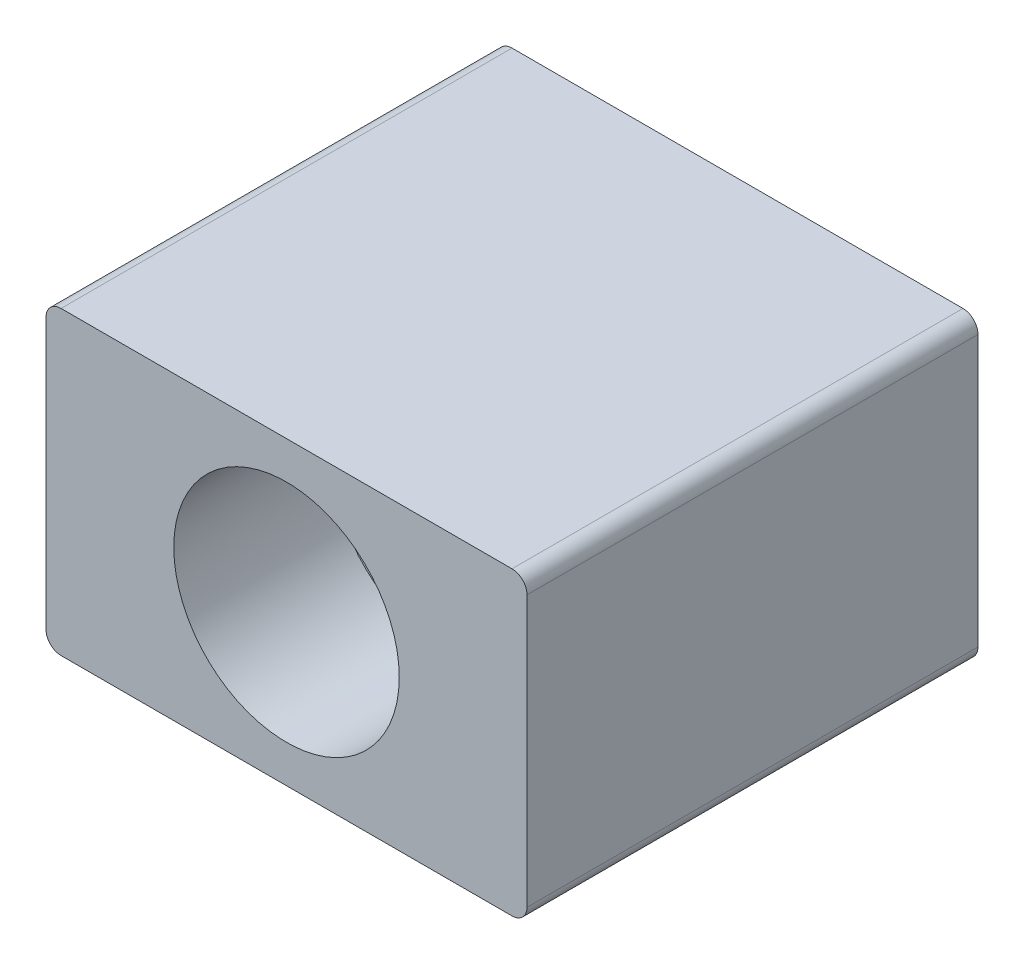
ISO-10303-21;
HEADER;
FILE_DESCRIPTION(('STEP AP214'),'2;1');
FILE_NAME('part.step','',(''),(''),'','','');
FILE_SCHEMA(('AUTOMOTIVE_DESIGN { 1 0 10303 214 1 1 1 1 }'));
ENDSEC;
DATA;
#1=APPLICATION_CONTEXT('core data for automotive mechanical design processes');
#2=APPLICATION_PROTOCOL_DEFINITION('international standard','automotive_design',2000,#1);
#3=PRODUCT_CONTEXT('',#1,'mechanical');
#4=PRODUCT('Part','Part','',(#3));
#5=PRODUCT_RELATED_PRODUCT_CATEGORY('part','',(#4));
#6=PRODUCT_DEFINITION_FORMATION('','',#4);
#7=PRODUCT_DEFINITION_CONTEXT('part definition',#1,'design');
#8=PRODUCT_DEFINITION('design','',#6,#7);
#9=PRODUCT_DEFINITION_SHAPE('','',#8);
#10=(LENGTH_UNIT() NAMED_UNIT(*) SI_UNIT(.MILLI.,.METRE.));
#11=(NAMED_UNIT(*) PLANE_ANGLE_UNIT() SI_UNIT($,.RADIAN.));
#12=(NAMED_UNIT(*) SI_UNIT($,.STERADIAN.) SOLID_ANGLE_UNIT());
#13=UNCERTAINTY_MEASURE_WITH_UNIT(LENGTH_MEASURE(1.E-05),#10,'distance_accuracy_value','');
#14=(GEOMETRIC_REPRESENTATION_CONTEXT(3) GLOBAL_UNCERTAINTY_ASSIGNED_CONTEXT((#13)) GLOBAL_UNIT_ASSIGNED_CONTEXT((#10,
#11,#12)) REPRESENTATION_CONTEXT('',''));
#15=CARTESIAN_POINT('',(0.,0.,0.));
#16=DIRECTION('',(0.,0.,1.));
#17=DIRECTION('',(1.,0.,0.));
#18=AXIS2_PLACEMENT_3D('',#15,#16,#17);
#19=CARTESIAN_POINT('',(0.,0.,-15.));
#20=DIRECTION('',(0.,0.,1.));
#21=DIRECTION('',(1.,0.,0.));
#22=AXIS2_PLACEMENT_3D('',#19,#20,#21);
#23=CYLINDRICAL_SURFACE('',#22,5.25);
#24=CARTESIAN_POINT('',(0.,0.,4.5));
#25=DIRECTION('',(0.,0.,1.));
#26=DIRECTION('',(1.,0.,0.));
#27=AXIS2_PLACEMENT_3D('',#24,#25,#26);
#28=CIRCLE('',#27,5.25);
#29=CARTESIAN_POINT('',(5.25000000000001,0.,4.5));
#30=VERTEX_POINT('',#29);
#31=EDGE_CURVE('E136',#30,#30,#28,.F.);
#32=ORIENTED_EDGE('',*,*,#31,.F.);
#33=EDGE_LOOP('',(#32));
#34=FACE_BOUND('',#33,.T.);
#35=CARTESIAN_POINT('',(0.,0.,-4.5));
#36=DIRECTION('',(0.,0.,-1.));
#37=DIRECTION('',(-1.,0.,0.));
#38=AXIS2_PLACEMENT_3D('',#35,#36,#37);
#39=CIRCLE('',#38,5.25);
#40=CARTESIAN_POINT('',(-5.24999999999999,0.,-4.5));
#41=VERTEX_POINT('',#40);
#42=EDGE_CURVE('E37',#41,#41,#39,.F.);
#43=ORIENTED_EDGE('',*,*,#42,.F.);
#44=EDGE_LOOP('',(#43));
#45=FACE_BOUND('',#44,.T.);
#46=ADVANCED_FACE('F33',(#34,#45),#23,.F.);
#47=CARTESIAN_POINT('',(15.,9.00000000000001,-15.));
#48=DIRECTION('',(0.,0.,1.));
#49=DIRECTION('',(1.,0.,0.));
#50=AXIS2_PLACEMENT_3D('',#47,#48,#49);
#51=CYLINDRICAL_SURFACE('',#50,1.);
#52=CARTESIAN_POINT('',(15.,9.00000000000001,15.));
#53=DIRECTION('',(0.,0.,1.));
#54=DIRECTION('',(1.,0.,0.));
#55=AXIS2_PLACEMENT_3D('',#52,#53,#54);
#56=CIRCLE('',#55,1.);
#57=CARTESIAN_POINT('',(16.,9.,15.));
#58=VERTEX_POINT('',#57);
#59=CARTESIAN_POINT('',(15.,10.,15.));
#60=VERTEX_POINT('',#59);
#61=EDGE_CURVE('E132',#58,#60,#56,.T.);
#62=ORIENTED_EDGE('',*,*,#61,.F.);
#63=DIRECTION('',(0.,0.,1.));
#64=VECTOR('',#63,1.);
#65=CARTESIAN_POINT('',(16.,9.,-15.));
#66=LINE('',#65,#64);
#67=CARTESIAN_POINT('',(16.,9.,-15.));
#68=VERTEX_POINT('',#67);
#69=EDGE_CURVE('E11',#68,#58,#66,.T.);
#70=ORIENTED_EDGE('',*,*,#69,.F.);
#71=CARTESIAN_POINT('',(15.,9.00000000000001,-15.));
#72=DIRECTION('',(0.,0.,1.));
#73=DIRECTION('',(1.,0.,0.));
#74=AXIS2_PLACEMENT_3D('',#71,#72,#73);
#75=CIRCLE('',#74,1.);
#76=CARTESIAN_POINT('',(15.,10.,-15.));
#77=VERTEX_POINT('',#76);
#78=EDGE_CURVE('E153',#68,#77,#75,.T.);
#79=ORIENTED_EDGE('',*,*,#78,.T.);
#80=DIRECTION('',(0.,0.,1.));
#81=VECTOR('',#80,1.);
#82=CARTESIAN_POINT('',(15.,10.,-15.));
#83=LINE('',#82,#81);
#84=EDGE_CURVE('E90',#77,#60,#83,.T.);
#85=ORIENTED_EDGE('',*,*,#84,.T.);
#86=EDGE_LOOP('',(#62,#70,#79,#85));
#87=FACE_BOUND('',#86,.T.);
#88=ADVANCED_FACE('F35',(#87),#51,.T.);
#89=CARTESIAN_POINT('',(16.,9.,-15.));
#90=DIRECTION('',(1.,0.,0.));
#91=DIRECTION('',(0.,1.,0.));
#92=AXIS2_PLACEMENT_3D('',#89,#90,#91);
#93=PLANE('',#92);
#94=DIRECTION('',(0.,1.,0.));
#95=VECTOR('',#94,1.);
#96=CARTESIAN_POINT('',(16.,9.,15.));
#97=LINE('',#96,#95);
#98=CARTESIAN_POINT('',(16.,-8.99999999999999,15.));
#99=VERTEX_POINT('',#98);
#100=EDGE_CURVE('E151',#99,#58,#97,.T.);
#101=ORIENTED_EDGE('',*,*,#100,.F.);
#102=DIRECTION('',(0.,0.,1.));
#103=VECTOR('',#102,1.);
#104=CARTESIAN_POINT('',(16.,-8.99999999999999,-15.));
#105=LINE('',#104,#103);
#106=CARTESIAN_POINT('',(16.,-8.99999999999999,-15.));
#107=VERTEX_POINT('',#106);
#108=EDGE_CURVE('E43',#107,#99,#105,.T.);
#109=ORIENTED_EDGE('',*,*,#108,.F.);
#110=DIRECTION('',(0.,1.,0.));
#111=VECTOR('',#110,1.);
#112=CARTESIAN_POINT('',(16.,9.,-15.));
#113=LINE('',#112,#111);
#114=EDGE_CURVE('E122',#107,#68,#113,.T.);
#115=ORIENTED_EDGE('',*,*,#114,.T.);
#116=ORIENTED_EDGE('',*,*,#69,.T.);
#117=EDGE_LOOP('',(#101,#109,#115,#116));
#118=FACE_BOUND('',#117,.T.);
#119=ADVANCED_FACE('F196',(#118),#93,.T.);
#120=CARTESIAN_POINT('',(15.,-9.,-15.));
#121=DIRECTION('',(0.,0.,1.));
#122=DIRECTION('',(1.,0.,0.));
#123=AXIS2_PLACEMENT_3D('',#120,#121,#122);
#124=CYLINDRICAL_SURFACE('',#123,0.999999999999999);
#125=CARTESIAN_POINT('',(15.,-9.,15.));
#126=DIRECTION('',(0.,0.,1.));
#127=DIRECTION('',(1.,0.,0.));
#128=AXIS2_PLACEMENT_3D('',#125,#126,#127);
#129=CIRCLE('',#128,0.999999999999999);
#130=CARTESIAN_POINT('',(15.,-10.,15.));
#131=VERTEX_POINT('',#130);
#132=EDGE_CURVE('E109',#131,#99,#129,.T.);
#133=ORIENTED_EDGE('',*,*,#132,.F.);
#134=DIRECTION('',(0.,0.,1.));
#135=VECTOR('',#134,1.);
#136=CARTESIAN_POINT('',(15.,-10.,-15.));
#137=LINE('',#136,#135);
#138=CARTESIAN_POINT('',(15.,-10.,-15.));
#139=VERTEX_POINT('',#138);
#140=EDGE_CURVE('E104',#139,#131,#137,.T.);
#141=ORIENTED_EDGE('',*,*,#140,.F.);
#142=CARTESIAN_POINT('',(15.,-9.,-15.));
#143=DIRECTION('',(0.,0.,1.));
#144=DIRECTION('',(1.,0.,0.));
#145=AXIS2_PLACEMENT_3D('',#142,#143,#144);
#146=CIRCLE('',#145,0.999999999999999);
#147=EDGE_CURVE('E107',#139,#107,#146,.T.);
#148=ORIENTED_EDGE('',*,*,#147,.T.);
#149=ORIENTED_EDGE('',*,*,#108,.T.);
#150=EDGE_LOOP('',(#133,#141,#148,#149));
#151=FACE_BOUND('',#150,.T.);
#152=ADVANCED_FACE('F106',(#151),#124,.T.);
#153=CARTESIAN_POINT('',(-15.,-10.,-15.));
#154=DIRECTION('',(0.,-1.,0.));
#155=DIRECTION('',(0.,0.,-1.));
#156=AXIS2_PLACEMENT_3D('',#153,#154,#155);
#157=PLANE('',#156);
#158=DIRECTION('',(1.,0.,0.));
#159=VECTOR('',#158,1.);
#160=CARTESIAN_POINT('',(-15.,-10.,15.));
#161=LINE('',#160,#159);
#162=CARTESIAN_POINT('',(-15.,-10.,15.));
#163=VERTEX_POINT('',#162);
#164=EDGE_CURVE('E148',#163,#131,#161,.T.);
#165=ORIENTED_EDGE('',*,*,#164,.F.);
#166=DIRECTION('',(0.,0.,1.));
#167=VECTOR('',#166,1.);
#168=CARTESIAN_POINT('',(-15.,-10.,-15.));
#169=LINE('',#168,#167);
#170=CARTESIAN_POINT('',(-15.,-10.,-15.));
#171=VERTEX_POINT('',#170);
#172=EDGE_CURVE('E114',#171,#163,#169,.T.);
#173=ORIENTED_EDGE('',*,*,#172,.F.);
#174=DIRECTION('',(1.,0.,0.));
#175=VECTOR('',#174,1.);
#176=CARTESIAN_POINT('',(-15.,-10.,-15.));
#177=LINE('',#176,#175);
#178=EDGE_CURVE('E120',#171,#139,#177,.T.);
#179=ORIENTED_EDGE('',*,*,#178,.T.);
#180=ORIENTED_EDGE('',*,*,#140,.T.);
#181=EDGE_LOOP('',(#165,#173,#179,#180));
#182=FACE_BOUND('',#181,.T.);
#183=ADVANCED_FACE('F124',(#182),#157,.T.);
#184=CARTESIAN_POINT('',(-15.,-9.,-15.));
#185=DIRECTION('',(0.,0.,1.));
#186=DIRECTION('',(1.,0.,0.));
#187=AXIS2_PLACEMENT_3D('',#184,#185,#186);
#188=CYLINDRICAL_SURFACE('',#187,0.999999999999999);
#189=CARTESIAN_POINT('',(-15.,-9.,15.));
#190=DIRECTION('',(0.,0.,1.));
#191=DIRECTION('',(-1.,0.,0.));
#192=AXIS2_PLACEMENT_3D('',#189,#190,#191);
#193=CIRCLE('',#192,0.999999999999999);
#194=CARTESIAN_POINT('',(-16.,-9.,15.));
#195=VERTEX_POINT('',#194);
#196=EDGE_CURVE('E145',#195,#163,#193,.T.);
#197=ORIENTED_EDGE('',*,*,#196,.F.);
#198=DIRECTION('',(0.,0.,1.));
#199=VECTOR('',#198,1.);
#200=CARTESIAN_POINT('',(-16.,-9.,-15.));
#201=LINE('',#200,#199);
#202=CARTESIAN_POINT('',(-16.,-9.,-15.));
#203=VERTEX_POINT('',#202);
#204=EDGE_CURVE('E157',#203,#195,#201,.T.);
#205=ORIENTED_EDGE('',*,*,#204,.F.);
#206=CARTESIAN_POINT('',(-15.,-9.,-15.));
#207=DIRECTION('',(0.,0.,1.));
#208=DIRECTION('',(-1.,0.,0.));
#209=AXIS2_PLACEMENT_3D('',#206,#207,#208);
#210=CIRCLE('',#209,0.999999999999999);
#211=EDGE_CURVE('E125',#203,#171,#210,.T.);
#212=ORIENTED_EDGE('',*,*,#211,.T.);
#213=ORIENTED_EDGE('',*,*,#172,.T.);
#214=EDGE_LOOP('',(#197,#205,#212,#213));
#215=FACE_BOUND('',#214,.T.);
#216=ADVANCED_FACE('F302',(#215),#188,.T.);
#217=CARTESIAN_POINT('',(-16.,9.,-15.));
#218=DIRECTION('',(-1.,0.,0.));
#219=DIRECTION('',(0.,-1.,0.));
#220=AXIS2_PLACEMENT_3D('',#217,#218,#219);
#221=PLANE('',#220);
#222=DIRECTION('',(0.,-1.,0.));
#223=VECTOR('',#222,1.);
#224=CARTESIAN_POINT('',(-16.,9.,15.));
#225=LINE('',#224,#223);
#226=CARTESIAN_POINT('',(-16.,9.,15.));
#227=VERTEX_POINT('',#226);
#228=EDGE_CURVE('E142',#227,#195,#225,.T.);
#229=ORIENTED_EDGE('',*,*,#228,.F.);
#230=DIRECTION('',(0.,0.,1.));
#231=VECTOR('',#230,1.);
#232=CARTESIAN_POINT('',(-16.,9.,-15.));
#233=LINE('',#232,#231);
#234=CARTESIAN_POINT('',(-16.,9.,-15.));
#235=VERTEX_POINT('',#234);
#236=EDGE_CURVE('E159',#235,#227,#233,.T.);
#237=ORIENTED_EDGE('',*,*,#236,.F.);
#238=DIRECTION('',(0.,-1.,0.));
#239=VECTOR('',#238,1.);
#240=CARTESIAN_POINT('',(-16.,9.,-15.));
#241=LINE('',#240,#239);
#242=EDGE_CURVE('E127',#235,#203,#241,.T.);
#243=ORIENTED_EDGE('',*,*,#242,.T.);
#244=ORIENTED_EDGE('',*,*,#204,.T.);
#245=EDGE_LOOP('',(#229,#237,#243,#244));
#246=FACE_BOUND('',#245,.T.);
#247=ADVANCED_FACE('F187',(#246),#221,.T.);
#248=CARTESIAN_POINT('',(-15.,9.00000000000001,-15.));
#249=DIRECTION('',(0.,0.,1.));
#250=DIRECTION('',(1.,0.,0.));
#251=AXIS2_PLACEMENT_3D('',#248,#249,#250);
#252=CYLINDRICAL_SURFACE('',#251,1.);
#253=CARTESIAN_POINT('',(-15.,9.00000000000001,15.));
#254=DIRECTION('',(0.,0.,1.));
#255=DIRECTION('',(-1.,0.,0.));
#256=AXIS2_PLACEMENT_3D('',#253,#254,#255);
#257=CIRCLE('',#256,1.);
#258=CARTESIAN_POINT('',(-15.,10.,15.));
#259=VERTEX_POINT('',#258);
#260=EDGE_CURVE('E139',#259,#227,#257,.T.);
#261=ORIENTED_EDGE('',*,*,#260,.F.);
#262=DIRECTION('',(0.,0.,1.));
#263=VECTOR('',#262,1.);
#264=CARTESIAN_POINT('',(-15.,10.,-15.));
#265=LINE('',#264,#263);
#266=CARTESIAN_POINT('',(-15.,10.,-15.));
#267=VERTEX_POINT('',#266);
#268=EDGE_CURVE('E161',#267,#259,#265,.T.);
#269=ORIENTED_EDGE('',*,*,#268,.F.);
#270=CARTESIAN_POINT('',(-15.,9.00000000000001,-15.));
#271=DIRECTION('',(0.,0.,1.));
#272=DIRECTION('',(-1.,0.,0.));
#273=AXIS2_PLACEMENT_3D('',#270,#271,#272);
#274=CIRCLE('',#273,1.);
#275=EDGE_CURVE('E181',#267,#235,#274,.T.);
#276=ORIENTED_EDGE('',*,*,#275,.T.);
#277=ORIENTED_EDGE('',*,*,#236,.T.);
#278=EDGE_LOOP('',(#261,#269,#276,#277));
#279=FACE_BOUND('',#278,.T.);
#280=ADVANCED_FACE('F192',(#279),#252,.T.);
#281=CARTESIAN_POINT('',(-15.,10.,-15.));
#282=DIRECTION('',(0.,1.,0.));
#283=DIRECTION('',(0.,0.,1.));
#284=AXIS2_PLACEMENT_3D('',#281,#282,#283);
#285=PLANE('',#284);
#286=DIRECTION('',(-1.,0.,0.));
#287=VECTOR('',#286,1.);
#288=CARTESIAN_POINT('',(-15.,10.,15.));
#289=LINE('',#288,#287);
#290=EDGE_CURVE('E135',#60,#259,#289,.T.);
#291=ORIENTED_EDGE('',*,*,#290,.F.);
#292=ORIENTED_EDGE('',*,*,#84,.F.);
#293=DIRECTION('',(-1.,0.,0.));
#294=VECTOR('',#293,1.);
#295=CARTESIAN_POINT('',(-15.,10.,-15.));
#296=LINE('',#295,#294);
#297=EDGE_CURVE('E179',#77,#267,#296,.T.);
#298=ORIENTED_EDGE('',*,*,#297,.T.);
#299=ORIENTED_EDGE('',*,*,#268,.T.);
#300=EDGE_LOOP('',(#291,#292,#298,#299));
#301=FACE_BOUND('',#300,.T.);
#302=ADVANCED_FACE('F193',(#301),#285,.T.);
#303=CARTESIAN_POINT('',(15.,9.00000000000001,-15.));
#304=DIRECTION('',(0.,0.,1.));
#305=DIRECTION('',(1.,0.,0.));
#306=AXIS2_PLACEMENT_3D('',#303,#304,#305);
#307=PLANE('',#306);
#308=CARTESIAN_POINT('',(0.,0.,-15.));
#309=DIRECTION('',(0.,0.,1.));
#310=DIRECTION('',(1.,0.,0.));
#311=AXIS2_PLACEMENT_3D('',#308,#309,#310);
#312=CIRCLE('',#311,7.5);
#313=CARTESIAN_POINT('',(-7.5,0.,-15.));
#314=VERTEX_POINT('',#313);
#315=EDGE_CURVE('E175',#314,#314,#312,.T.);
#316=ORIENTED_EDGE('',*,*,#315,.T.);
#317=EDGE_LOOP('',(#316));
#318=FACE_BOUND('',#317,.T.);
#319=ORIENTED_EDGE('',*,*,#78,.F.);
#320=ORIENTED_EDGE('',*,*,#114,.F.);
#321=ORIENTED_EDGE('',*,*,#147,.F.);
#322=ORIENTED_EDGE('',*,*,#178,.F.);
#323=ORIENTED_EDGE('',*,*,#211,.F.);
#324=ORIENTED_EDGE('',*,*,#242,.F.);
#325=ORIENTED_EDGE('',*,*,#275,.F.);
#326=ORIENTED_EDGE('',*,*,#297,.F.);
#327=EDGE_LOOP('',(#319,#320,#321,#322,#323,#324,#325,#326));
#328=FACE_BOUND('',#327,.T.);
#329=ADVANCED_FACE('F118',(#318,#328),#307,.F.);
#330=CARTESIAN_POINT('',(15.,9.00000000000001,15.));
#331=DIRECTION('',(0.,0.,1.));
#332=DIRECTION('',(1.,0.,0.));
#333=AXIS2_PLACEMENT_3D('',#330,#331,#332);
#334=PLANE('',#333);
#335=CARTESIAN_POINT('',(0.,0.,15.));
#336=DIRECTION('',(0.,0.,1.));
#337=DIRECTION('',(1.,0.,0.));
#338=AXIS2_PLACEMENT_3D('',#335,#336,#337);
#339=CIRCLE('',#338,7.5);
#340=CARTESIAN_POINT('',(7.5,0.,15.));
#341=VERTEX_POINT('',#340);
#342=EDGE_CURVE('E168',#341,#341,#339,.T.);
#343=ORIENTED_EDGE('',*,*,#342,.F.);
#344=EDGE_LOOP('',(#343));
#345=FACE_BOUND('',#344,.T.);
#346=ORIENTED_EDGE('',*,*,#61,.T.);
#347=ORIENTED_EDGE('',*,*,#290,.T.);
#348=ORIENTED_EDGE('',*,*,#260,.T.);
#349=ORIENTED_EDGE('',*,*,#228,.T.);
#350=ORIENTED_EDGE('',*,*,#196,.T.);
#351=ORIENTED_EDGE('',*,*,#164,.T.);
#352=ORIENTED_EDGE('',*,*,#132,.T.);
#353=ORIENTED_EDGE('',*,*,#100,.T.);
#354=EDGE_LOOP('',(#346,#347,#348,#349,#350,#351,#352,#353));
#355=FACE_BOUND('',#354,.T.);
#356=ADVANCED_FACE('F195',(#345,#355),#334,.T.);
#357=CARTESIAN_POINT('',(0.,0.,4.5));
#358=DIRECTION('',(0.,0.,1.));
#359=DIRECTION('',(1.,0.,0.));
#360=AXIS2_PLACEMENT_3D('',#357,#358,#359);
#361=PLANE('',#360);
#362=CARTESIAN_POINT('',(0.,0.,4.5));
#363=DIRECTION('',(0.,0.,1.));
#364=DIRECTION('',(1.,0.,0.));
#365=AXIS2_PLACEMENT_3D('',#362,#363,#364);
#366=CIRCLE('',#365,7.5);
#367=CARTESIAN_POINT('',(7.5,0.,4.5));
#368=VERTEX_POINT('',#367);
#369=EDGE_CURVE('E164',#368,#368,#366,.T.);
#370=ORIENTED_EDGE('',*,*,#369,.T.);
#371=EDGE_LOOP('',(#370));
#372=FACE_BOUND('',#371,.T.);
#373=ORIENTED_EDGE('',*,*,#31,.T.);
#374=EDGE_LOOP('',(#373));
#375=FACE_BOUND('',#374,.T.);
#376=ADVANCED_FACE('F218',(#372,#375),#361,.T.);
#377=CARTESIAN_POINT('',(0.,0.,4.5));
#378=DIRECTION('',(0.,0.,1.));
#379=DIRECTION('',(1.,0.,0.));
#380=AXIS2_PLACEMENT_3D('',#377,#378,#379);
#381=CYLINDRICAL_SURFACE('',#380,7.5);
#382=CARTESIAN_POINT('',(7.5,0.,4.5));
#383=CARTESIAN_POINT('',(7.5,0.,4.609375));
#384=CARTESIAN_POINT('',(7.5,0.,4.71875));
#385=CARTESIAN_POINT('',(7.5,0.,4.9375));
#386=CARTESIAN_POINT('',(7.5,0.,5.046875));
#387=CARTESIAN_POINT('',(7.5,0.,5.265625));
#388=CARTESIAN_POINT('',(7.5,0.,5.375));
#389=CARTESIAN_POINT('',(7.5,0.,5.59375));
#390=CARTESIAN_POINT('',(7.5,0.,5.703125));
#391=CARTESIAN_POINT('',(7.5,0.,5.921875));
#392=CARTESIAN_POINT('',(7.5,0.,6.03125));
#393=CARTESIAN_POINT('',(7.5,0.,6.25));
#394=CARTESIAN_POINT('',(7.5,0.,6.359375));
#395=CARTESIAN_POINT('',(7.5,0.,6.578125));
#396=CARTESIAN_POINT('',(7.5,0.,6.6875));
#397=CARTESIAN_POINT('',(7.5,0.,6.90625));
#398=CARTESIAN_POINT('',(7.5,0.,7.015625));
#399=CARTESIAN_POINT('',(7.5,0.,7.234375));
#400=CARTESIAN_POINT('',(7.5,0.,7.34375));
#401=CARTESIAN_POINT('',(7.5,0.,7.5625));
#402=CARTESIAN_POINT('',(7.5,0.,7.671875));
#403=CARTESIAN_POINT('',(7.5,0.,7.890625));
#404=CARTESIAN_POINT('',(7.5,0.,8.));
#405=CARTESIAN_POINT('',(7.5,0.,8.21875));
#406=CARTESIAN_POINT('',(7.5,0.,8.328125));
#407=CARTESIAN_POINT('',(7.5,0.,8.546875));
#408=CARTESIAN_POINT('',(7.5,0.,8.65625));
#409=CARTESIAN_POINT('',(7.5,0.,8.875));
#410=CARTESIAN_POINT('',(7.5,0.,8.984375));
#411=CARTESIAN_POINT('',(7.5,0.,9.203125));
#412=CARTESIAN_POINT('',(7.5,0.,9.3125));
#413=CARTESIAN_POINT('',(7.5,0.,9.53125));
#414=CARTESIAN_POINT('',(7.5,0.,9.640625));
#415=CARTESIAN_POINT('',(7.5,0.,9.859375));
#416=CARTESIAN_POINT('',(7.5,0.,9.96875));
#417=CARTESIAN_POINT('',(7.5,0.,10.1875));
#418=CARTESIAN_POINT('',(7.5,0.,10.296875));
#419=CARTESIAN_POINT('',(7.5,0.,10.515625));
#420=CARTESIAN_POINT('',(7.5,0.,10.625));
#421=CARTESIAN_POINT('',(7.5,0.,10.84375));
#422=CARTESIAN_POINT('',(7.5,0.,10.953125));
#423=CARTESIAN_POINT('',(7.5,0.,11.171875));
#424=CARTESIAN_POINT('',(7.5,0.,11.28125));
#425=CARTESIAN_POINT('',(7.5,0.,11.5));
#426=CARTESIAN_POINT('',(7.5,0.,11.609375));
#427=CARTESIAN_POINT('',(7.5,0.,11.828125));
#428=CARTESIAN_POINT('',(7.5,0.,11.9375));
#429=CARTESIAN_POINT('',(7.5,0.,12.15625));
#430=CARTESIAN_POINT('',(7.5,0.,12.265625));
#431=CARTESIAN_POINT('',(7.5,0.,12.484375));
#432=CARTESIAN_POINT('',(7.5,0.,12.59375));
#433=CARTESIAN_POINT('',(7.5,0.,12.8125));
#434=CARTESIAN_POINT('',(7.5,0.,12.921875));
#435=CARTESIAN_POINT('',(7.5,0.,13.140625));
#436=CARTESIAN_POINT('',(7.5,0.,13.25));
#437=CARTESIAN_POINT('',(7.5,0.,13.46875));
#438=CARTESIAN_POINT('',(7.5,0.,13.578125));
#439=CARTESIAN_POINT('',(7.5,0.,13.796875));
#440=CARTESIAN_POINT('',(7.5,0.,13.90625));
#441=CARTESIAN_POINT('',(7.5,0.,14.125));
#442=CARTESIAN_POINT('',(7.5,0.,14.234375));
#443=CARTESIAN_POINT('',(7.5,0.,14.453125));
#444=CARTESIAN_POINT('',(7.5,0.,14.5625));
#445=CARTESIAN_POINT('',(7.5,0.,14.78125));
#446=CARTESIAN_POINT('',(7.5,0.,14.890625));
#447=CARTESIAN_POINT('',(7.5,0.,15.));
#448=B_SPLINE_CURVE_WITH_KNOTS('',3,(#382,#383,#384,#385,#386,#387,#388,#389,#390,#391,#392,
#393,#394,#395,#396,#397,#398,#399,#400,#401,#402,#403,#404,#405,#406,#407,#408,#409,#410,#411,
#412,#413,#414,#415,#416,#417,#418,#419,#420,#421,#422,#423,#424,#425,#426,#427,#428,#429,#430,
#431,#432,#433,#434,#435,#436,#437,#438,#439,#440,#441,#442,#443,#444,#445,#446,#447),
.UNSPECIFIED.,.F.,.F.,(4,2,2,2,2,2,2,2,2,2,2,2,2,2,2,2,2,2,2,2,2,2,2,2,2,2,2,2,2,2,2,2,4),(0.,
0.328125,0.656250000000001,0.984375,1.3125,1.640625,1.96875,2.296875,2.625,2.953125,3.28125,
3.609375,3.9375,4.265625,4.59375,4.921875,5.25,5.578125,5.90625,6.234375,6.5625,6.890625,
7.21875,7.546875,7.875,8.203125,8.53125,8.859375,9.1875,9.515625,9.84375,10.171875,10.5),.UNSPECIFIED.);
#449=EDGE_CURVE('BSEAM213',#368,#341,#448,.T.);
#450=ORIENTED_EDGE('',*,*,#369,.F.);
#451=ORIENTED_EDGE('',*,*,#342,.T.);
#452=ORIENTED_EDGE('',*,*,#449,.T.);
#453=ORIENTED_EDGE('',*,*,#449,.F.);
#454=EDGE_LOOP('',(#450,#452,#451,#453));
#455=FACE_BOUND('',#454,.T.);
#456=ADVANCED_FACE('F213',(#455),#381,.F.);
#457=CARTESIAN_POINT('',(0.,0.,-4.5));
#458=DIRECTION('',(0.,0.,-1.));
#459=DIRECTION('',(1.,0.,0.));
#460=AXIS2_PLACEMENT_3D('',#457,#458,#459);
#461=PLANE('',#460);
#462=CARTESIAN_POINT('',(0.,0.,-4.5));
#463=DIRECTION('',(0.,0.,1.));
#464=DIRECTION('',(1.,0.,0.));
#465=AXIS2_PLACEMENT_3D('',#462,#463,#464);
#466=CIRCLE('',#465,7.5);
#467=CARTESIAN_POINT('',(-7.5,0.,-4.5));
#468=VERTEX_POINT('',#467);
#469=EDGE_CURVE('E242',#468,#468,#466,.T.);
#470=ORIENTED_EDGE('',*,*,#469,.F.);
#471=EDGE_LOOP('',(#470));
#472=FACE_BOUND('',#471,.T.);
#473=ORIENTED_EDGE('',*,*,#42,.T.);
#474=EDGE_LOOP('',(#473));
#475=FACE_BOUND('',#474,.T.);
#476=ADVANCED_FACE('F226',(#472,#475),#461,.T.);
#477=CARTESIAN_POINT('',(0.,0.,-4.5));
#478=DIRECTION('',(0.,0.,-1.));
#479=DIRECTION('',(-1.,0.,0.));
#480=AXIS2_PLACEMENT_3D('',#477,#478,#479);
#481=CYLINDRICAL_SURFACE('',#480,7.5);
#482=CARTESIAN_POINT('',(-7.5,0.,-4.5));
#483=CARTESIAN_POINT('',(-7.5,0.,-4.609375));
#484=CARTESIAN_POINT('',(-7.5,0.,-4.71875));
#485=CARTESIAN_POINT('',(-7.5,0.,-4.9375));
#486=CARTESIAN_POINT('',(-7.5,0.,-5.046875));
#487=CARTESIAN_POINT('',(-7.5,0.,-5.265625));
#488=CARTESIAN_POINT('',(-7.5,0.,-5.375));
#489=CARTESIAN_POINT('',(-7.5,0.,-5.59375));
#490=CARTESIAN_POINT('',(-7.5,0.,-5.703125));
#491=CARTESIAN_POINT('',(-7.5,0.,-5.921875));
#492=CARTESIAN_POINT('',(-7.5,0.,-6.03125));
#493=CARTESIAN_POINT('',(-7.5,0.,-6.25));
#494=CARTESIAN_POINT('',(-7.5,0.,-6.359375));
#495=CARTESIAN_POINT('',(-7.5,0.,-6.578125));
#496=CARTESIAN_POINT('',(-7.5,0.,-6.6875));
#497=CARTESIAN_POINT('',(-7.5,0.,-6.90625));
#498=CARTESIAN_POINT('',(-7.5,0.,-7.015625));
#499=CARTESIAN_POINT('',(-7.5,0.,-7.234375));
#500=CARTESIAN_POINT('',(-7.5,0.,-7.34375));
#501=CARTESIAN_POINT('',(-7.5,0.,-7.5625));
#502=CARTESIAN_POINT('',(-7.5,0.,-7.671875));
#503=CARTESIAN_POINT('',(-7.5,0.,-7.890625));
#504=CARTESIAN_POINT('',(-7.5,0.,-8.));
#505=CARTESIAN_POINT('',(-7.5,0.,-8.21875));
#506=CARTESIAN_POINT('',(-7.5,0.,-8.328125));
#507=CARTESIAN_POINT('',(-7.5,0.,-8.546875));
#508=CARTESIAN_POINT('',(-7.5,0.,-8.65625));
#509=CARTESIAN_POINT('',(-7.5,0.,-8.875));
#510=CARTESIAN_POINT('',(-7.5,0.,-8.984375));
#511=CARTESIAN_POINT('',(-7.5,0.,-9.203125));
#512=CARTESIAN_POINT('',(-7.5,0.,-9.3125));
#513=CARTESIAN_POINT('',(-7.5,0.,-9.53125));
#514=CARTESIAN_POINT('',(-7.5,0.,-9.640625));
#515=CARTESIAN_POINT('',(-7.5,0.,-9.859375));
#516=CARTESIAN_POINT('',(-7.5,0.,-9.96875));
#517=CARTESIAN_POINT('',(-7.5,0.,-10.1875));
#518=CARTESIAN_POINT('',(-7.5,0.,-10.296875));
#519=CARTESIAN_POINT('',(-7.5,0.,-10.515625));
#520=CARTESIAN_POINT('',(-7.5,0.,-10.625));
#521=CARTESIAN_POINT('',(-7.5,0.,-10.84375));
#522=CARTESIAN_POINT('',(-7.5,0.,-10.953125));
#523=CARTESIAN_POINT('',(-7.5,0.,-11.171875));
#524=CARTESIAN_POINT('',(-7.5,0.,-11.28125));
#525=CARTESIAN_POINT('',(-7.5,0.,-11.5));
#526=CARTESIAN_POINT('',(-7.5,0.,-11.609375));
#527=CARTESIAN_POINT('',(-7.5,0.,-11.828125));
#528=CARTESIAN_POINT('',(-7.5,0.,-11.9375));
#529=CARTESIAN_POINT('',(-7.5,0.,-12.15625));
#530=CARTESIAN_POINT('',(-7.5,0.,-12.265625));
#531=CARTESIAN_POINT('',(-7.5,0.,-12.484375));
#532=CARTESIAN_POINT('',(-7.5,0.,-12.59375));
#533=CARTESIAN_POINT('',(-7.5,0.,-12.8125));
#534=CARTESIAN_POINT('',(-7.5,0.,-12.921875));
#535=CARTESIAN_POINT('',(-7.5,0.,-13.140625));
#536=CARTESIAN_POINT('',(-7.5,0.,-13.25));
#537=CARTESIAN_POINT('',(-7.5,0.,-13.46875));
#538=CARTESIAN_POINT('',(-7.5,0.,-13.578125));
#539=CARTESIAN_POINT('',(-7.5,0.,-13.796875));
#540=CARTESIAN_POINT('',(-7.5,0.,-13.90625));
#541=CARTESIAN_POINT('',(-7.5,0.,-14.125));
#542=CARTESIAN_POINT('',(-7.5,0.,-14.234375));
#543=CARTESIAN_POINT('',(-7.5,0.,-14.453125));
#544=CARTESIAN_POINT('',(-7.5,0.,-14.5625));
#545=CARTESIAN_POINT('',(-7.5,0.,-14.78125));
#546=CARTESIAN_POINT('',(-7.5,0.,-14.890625));
#547=CARTESIAN_POINT('',(-7.5,0.,-15.));
#548=B_SPLINE_CURVE_WITH_KNOTS('',3,(#482,#483,#484,#485,#486,#487,#488,#489,#490,#491,#492,
#493,#494,#495,#496,#497,#498,#499,#500,#501,#502,#503,#504,#505,#506,#507,#508,#509,#510,#511,
#512,#513,#514,#515,#516,#517,#518,#519,#520,#521,#522,#523,#524,#525,#526,#527,#528,#529,#530,
#531,#532,#533,#534,#535,#536,#537,#538,#539,#540,#541,#542,#543,#544,#545,#546,#547),
.UNSPECIFIED.,.F.,.F.,(4,2,2,2,2,2,2,2,2,2,2,2,2,2,2,2,2,2,2,2,2,2,2,2,2,2,2,2,2,2,2,2,4),(0.,
0.328124999999999,0.65625,0.984375,1.3125,1.640625,1.96875,2.296875,2.625,2.953125,3.28125,
3.609375,3.9375,4.265625,4.59375,4.921875,5.25,5.578125,5.90625,6.234375,6.5625,6.890625,
7.21875,7.546875,7.875,8.203125,8.53125,8.859375,9.1875,9.515625,9.84375,10.171875,10.5),.UNSPECIFIED.);
#549=EDGE_CURVE('BSEAM231',#468,#314,#548,.T.);
#550=ORIENTED_EDGE('',*,*,#469,.T.);
#551=ORIENTED_EDGE('',*,*,#315,.F.);
#552=ORIENTED_EDGE('',*,*,#549,.T.);
#553=ORIENTED_EDGE('',*,*,#549,.F.);
#554=EDGE_LOOP('',(#550,#552,#551,#553));
#555=FACE_BOUND('',#554,.T.);
#556=ADVANCED_FACE('F231',(#555),#481,.F.);
#557=CLOSED_SHELL('',(#46,#88,#119,#152,#183,#216,#247,#280,#302,#329,#356,#376,#456,#476,#556));
#558=MANIFOLD_SOLID_BREP('B2',#557);
#559=ADVANCED_BREP_SHAPE_REPRESENTATION('',(#18,#558),#14);
#560=SHAPE_DEFINITION_REPRESENTATION(#9,#559);
ENDSEC;
END-ISO-10303-21;
